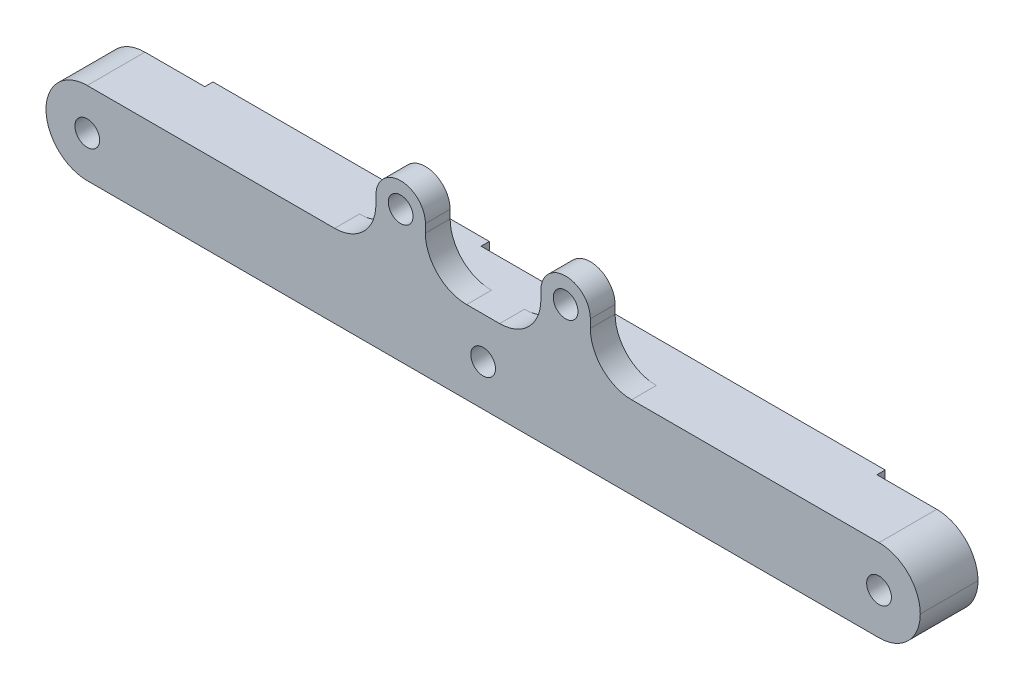
ISO-10303-21;
HEADER;
FILE_DESCRIPTION(('STEP AP214'),'2;1');
FILE_NAME('part.step','',(''),(''),'','','');
FILE_SCHEMA(('AUTOMOTIVE_DESIGN { 1 0 10303 214 1 1 1 1 }'));
ENDSEC;
DATA;
#1=APPLICATION_CONTEXT('core data for automotive mechanical design processes');
#2=APPLICATION_PROTOCOL_DEFINITION('international standard','automotive_design',2000,#1);
#3=PRODUCT_CONTEXT('',#1,'mechanical');
#4=PRODUCT('Part','Part','',(#3));
#5=PRODUCT_RELATED_PRODUCT_CATEGORY('part','',(#4));
#6=PRODUCT_DEFINITION_FORMATION('','',#4);
#7=PRODUCT_DEFINITION_CONTEXT('part definition',#1,'design');
#8=PRODUCT_DEFINITION('design','',#6,#7);
#9=PRODUCT_DEFINITION_SHAPE('','',#8);
#10=(LENGTH_UNIT() NAMED_UNIT(*) SI_UNIT(.MILLI.,.METRE.));
#11=(NAMED_UNIT(*) PLANE_ANGLE_UNIT() SI_UNIT($,.RADIAN.));
#12=(NAMED_UNIT(*) SI_UNIT($,.STERADIAN.) SOLID_ANGLE_UNIT());
#13=UNCERTAINTY_MEASURE_WITH_UNIT(LENGTH_MEASURE(1.E-05),#10,'distance_accuracy_value','');
#14=(GEOMETRIC_REPRESENTATION_CONTEXT(3) GLOBAL_UNCERTAINTY_ASSIGNED_CONTEXT((#13)) GLOBAL_UNIT_ASSIGNED_CONTEXT((#10,
#11,#12)) REPRESENTATION_CONTEXT('',''));
#15=CARTESIAN_POINT('',(0.,0.,0.));
#16=DIRECTION('',(0.,0.,1.));
#17=DIRECTION('',(1.,0.,0.));
#18=AXIS2_PLACEMENT_3D('',#15,#16,#17);
#19=CARTESIAN_POINT('',(0.,0.,0.));
#20=DIRECTION('',(0.,0.,-1.));
#21=DIRECTION('',(-1.,0.,0.));
#22=AXIS2_PLACEMENT_3D('',#19,#20,#21);
#23=PLANE('',#22);
#24=CARTESIAN_POINT('',(0.,0.,0.));
#25=DIRECTION('',(0.,0.,1.));
#26=DIRECTION('',(1.,0.,0.));
#27=AXIS2_PLACEMENT_3D('',#24,#25,#26);
#28=CIRCLE('',#27,1.5);
#29=CARTESIAN_POINT('',(1.5,0.,0.));
#30=VERTEX_POINT('',#29);
#31=EDGE_CURVE('E361',#30,#30,#28,.T.);
#32=ORIENTED_EDGE('',*,*,#31,.T.);
#33=EDGE_LOOP('',(#32));
#34=FACE_BOUND('',#33,.T.);
#35=DIRECTION('',(1.,0.,0.));
#36=VECTOR('',#35,1.);
#37=CARTESIAN_POINT('',(-53.,-5.,0.));
#38=LINE('',#37,#36);
#39=CARTESIAN_POINT('',(-7.25,-5.,0.));
#40=VERTEX_POINT('',#39);
#41=CARTESIAN_POINT('',(7.25,-5.,0.));
#42=VERTEX_POINT('',#41);
#43=EDGE_CURVE('E228',#40,#42,#38,.T.);
#44=ORIENTED_EDGE('',*,*,#43,.F.);
#45=DIRECTION('',(0.,-1.,0.));
#46=VECTOR('',#45,1.);
#47=CARTESIAN_POINT('',(-7.25,5.,0.));
#48=LINE('',#47,#46);
#49=CARTESIAN_POINT('',(-7.25,5.,0.));
#50=VERTEX_POINT('',#49);
#51=EDGE_CURVE('E217',#50,#40,#48,.T.);
#52=ORIENTED_EDGE('',*,*,#51,.F.);
#53=DIRECTION('',(-1.,0.,0.));
#54=VECTOR('',#53,1.);
#55=CARTESIAN_POINT('',(-53.,5.,0.));
#56=LINE('',#55,#54);
#57=CARTESIAN_POINT('',(7.25,5.,0.));
#58=VERTEX_POINT('',#57);
#59=EDGE_CURVE('E226',#58,#50,#56,.T.);
#60=ORIENTED_EDGE('',*,*,#59,.F.);
#61=DIRECTION('',(0.,1.,0.));
#62=VECTOR('',#61,1.);
#63=CARTESIAN_POINT('',(7.25,5.,0.));
#64=LINE('',#63,#62);
#65=EDGE_CURVE('E425',#42,#58,#64,.T.);
#66=ORIENTED_EDGE('',*,*,#65,.F.);
#67=EDGE_LOOP('',(#44,#52,#60,#66));
#68=FACE_BOUND('',#67,.T.);
#69=ADVANCED_FACE('F37',(#34,#68),#23,.T.);
#70=CARTESIAN_POINT('',(-48.,0.,0.));
#71=DIRECTION('',(0.,0.,1.));
#72=DIRECTION('',(1.,0.,0.));
#73=AXIS2_PLACEMENT_3D('',#70,#71,#72);
#74=CIRCLE('',#73,1.5);
#75=CARTESIAN_POINT('',(-46.5,0.,0.));
#76=VERTEX_POINT('',#75);
#77=EDGE_CURVE('E284',#76,#76,#74,.T.);
#78=ORIENTED_EDGE('',*,*,#77,.T.);
#79=EDGE_LOOP('',(#78));
#80=FACE_BOUND('',#79,.T.);
#81=CARTESIAN_POINT('',(-40.75,5.,0.));
#82=VERTEX_POINT('',#81);
#83=CARTESIAN_POINT('',(-48.,5.,0.));
#84=VERTEX_POINT('',#83);
#85=EDGE_CURVE('E237',#82,#84,#56,.T.);
#86=ORIENTED_EDGE('',*,*,#85,.F.);
#87=DIRECTION('',(0.,1.,0.));
#88=VECTOR('',#87,1.);
#89=CARTESIAN_POINT('',(-40.75,5.,0.));
#90=LINE('',#89,#88);
#91=CARTESIAN_POINT('',(-40.75,-5.,0.));
#92=VERTEX_POINT('',#91);
#93=EDGE_CURVE('E229',#92,#82,#90,.T.);
#94=ORIENTED_EDGE('',*,*,#93,.F.);
#95=CARTESIAN_POINT('',(-48.,-5.,0.));
#96=VERTEX_POINT('',#95);
#97=EDGE_CURVE('E245',#96,#92,#38,.T.);
#98=ORIENTED_EDGE('',*,*,#97,.F.);
#99=CARTESIAN_POINT('',(-48.,0.,0.));
#100=DIRECTION('',(0.,0.,-1.));
#101=DIRECTION('',(-1.,0.,0.));
#102=AXIS2_PLACEMENT_3D('',#99,#100,#101);
#103=CIRCLE('',#102,5.);
#104=CARTESIAN_POINT('',(-53.,0.,0.));
#105=VERTEX_POINT('',#104);
#106=EDGE_CURVE('E258',#96,#105,#103,.T.);
#107=ORIENTED_EDGE('',*,*,#106,.T.);
#108=CARTESIAN_POINT('',(-48.,0.,0.));
#109=DIRECTION('',(0.,0.,-1.));
#110=DIRECTION('',(-1.,0.,0.));
#111=AXIS2_PLACEMENT_3D('',#108,#109,#110);
#112=CIRCLE('',#111,5.);
#113=EDGE_CURVE('E255',#105,#84,#112,.T.);
#114=ORIENTED_EDGE('',*,*,#113,.T.);
#115=EDGE_LOOP('',(#86,#94,#98,#107,#114));
#116=FACE_BOUND('',#115,.T.);
#117=ADVANCED_FACE('F516',(#80,#116),#23,.T.);
#118=DIRECTION('',(0.,-1.,0.));
#119=VECTOR('',#118,1.);
#120=CARTESIAN_POINT('',(40.75,5.,0.));
#121=LINE('',#120,#119);
#122=CARTESIAN_POINT('',(40.75,5.,0.));
#123=VERTEX_POINT('',#122);
#124=CARTESIAN_POINT('',(40.75,-5.,0.));
#125=VERTEX_POINT('',#124);
#126=EDGE_CURVE('E60',#123,#125,#121,.T.);
#127=ORIENTED_EDGE('',*,*,#126,.F.);
#128=CARTESIAN_POINT('',(48.,5.,0.));
#129=VERTEX_POINT('',#128);
#130=EDGE_CURVE('E236',#129,#123,#56,.T.);
#131=ORIENTED_EDGE('',*,*,#130,.F.);
#132=CARTESIAN_POINT('',(48.,0.,0.));
#133=DIRECTION('',(0.,0.,-1.));
#134=DIRECTION('',(-1.,0.,0.));
#135=AXIS2_PLACEMENT_3D('',#132,#133,#134);
#136=CIRCLE('',#135,5.);
#137=CARTESIAN_POINT('',(53.,0.,0.));
#138=VERTEX_POINT('',#137);
#139=EDGE_CURVE('E260',#129,#138,#136,.T.);
#140=ORIENTED_EDGE('',*,*,#139,.T.);
#141=CARTESIAN_POINT('',(48.,0.,0.));
#142=DIRECTION('',(0.,0.,-1.));
#143=DIRECTION('',(-1.,0.,0.));
#144=AXIS2_PLACEMENT_3D('',#141,#142,#143);
#145=CIRCLE('',#144,5.);
#146=CARTESIAN_POINT('',(48.,-5.,0.));
#147=VERTEX_POINT('',#146);
#148=EDGE_CURVE('E262',#138,#147,#145,.T.);
#149=ORIENTED_EDGE('',*,*,#148,.T.);
#150=EDGE_CURVE('E239',#125,#147,#38,.T.);
#151=ORIENTED_EDGE('',*,*,#150,.F.);
#152=EDGE_LOOP('',(#127,#131,#140,#149,#151));
#153=FACE_BOUND('',#152,.T.);
#154=CARTESIAN_POINT('',(48.,0.,0.));
#155=DIRECTION('',(0.,0.,1.));
#156=DIRECTION('',(1.,0.,0.));
#157=AXIS2_PLACEMENT_3D('',#154,#155,#156);
#158=CIRCLE('',#157,1.5);
#159=CARTESIAN_POINT('',(49.5,0.,0.));
#160=VERTEX_POINT('',#159);
#161=EDGE_CURVE('E371',#160,#160,#158,.T.);
#162=ORIENTED_EDGE('',*,*,#161,.T.);
#163=EDGE_LOOP('',(#162));
#164=FACE_BOUND('',#163,.T.);
#165=ADVANCED_FACE('F411',(#153,#164),#23,.T.);
#166=CARTESIAN_POINT('',(-53.,5.,7.));
#167=DIRECTION('',(0.,-1.,0.));
#168=DIRECTION('',(0.,0.,-1.));
#169=AXIS2_PLACEMENT_3D('',#166,#167,#168);
#170=PLANE('',#169);
#171=DIRECTION('',(1.,0.,0.));
#172=VECTOR('',#171,1.);
#173=CARTESIAN_POINT('',(7.,5.,4.));
#174=LINE('',#173,#172);
#175=CARTESIAN_POINT('',(2.,5.,4.));
#176=VERTEX_POINT('',#175);
#177=CARTESIAN_POINT('',(18.,5.,4.));
#178=VERTEX_POINT('',#177);
#179=EDGE_CURVE('E345',#176,#178,#174,.T.);
#180=ORIENTED_EDGE('',*,*,#179,.T.);
#181=DIRECTION('',(0.,0.,1.));
#182=VECTOR('',#181,1.);
#183=CARTESIAN_POINT('',(18.,5.,7.));
#184=LINE('',#183,#182);
#185=CARTESIAN_POINT('',(18.,5.,7.));
#186=VERTEX_POINT('',#185);
#187=EDGE_CURVE('E314',#178,#186,#184,.T.);
#188=ORIENTED_EDGE('',*,*,#187,.T.);
#189=DIRECTION('',(-1.,0.,0.));
#190=VECTOR('',#189,1.);
#191=CARTESIAN_POINT('',(-53.,5.,7.));
#192=LINE('',#191,#190);
#193=CARTESIAN_POINT('',(48.,5.,7.));
#194=VERTEX_POINT('',#193);
#195=EDGE_CURVE('E328',#194,#186,#192,.T.);
#196=ORIENTED_EDGE('',*,*,#195,.F.);
#197=DIRECTION('',(0.,0.,-1.));
#198=VECTOR('',#197,1.);
#199=CARTESIAN_POINT('',(48.,5.,7.));
#200=LINE('',#199,#198);
#201=EDGE_CURVE('E276',#194,#129,#200,.T.);
#202=ORIENTED_EDGE('',*,*,#201,.T.);
#203=ORIENTED_EDGE('',*,*,#130,.T.);
#204=DIRECTION('',(0.,0.,1.));
#205=VECTOR('',#204,1.);
#206=CARTESIAN_POINT('',(40.75,5.,-1.));
#207=LINE('',#206,#205);
#208=CARTESIAN_POINT('',(40.75,5.,-1.));
#209=VERTEX_POINT('',#208);
#210=EDGE_CURVE('E424',#209,#123,#207,.T.);
#211=ORIENTED_EDGE('',*,*,#210,.F.);
#212=DIRECTION('',(1.,0.,0.));
#213=VECTOR('',#212,1.);
#214=CARTESIAN_POINT('',(40.75,5.,-1.));
#215=LINE('',#214,#213);
#216=CARTESIAN_POINT('',(7.25,5.,-1.));
#217=VERTEX_POINT('',#216);
#218=EDGE_CURVE('E430',#217,#209,#215,.T.);
#219=ORIENTED_EDGE('',*,*,#218,.F.);
#220=DIRECTION('',(0.,0.,1.));
#221=VECTOR('',#220,1.);
#222=CARTESIAN_POINT('',(7.25,5.,-1.));
#223=LINE('',#222,#221);
#224=EDGE_CURVE('E235',#217,#58,#223,.T.);
#225=ORIENTED_EDGE('',*,*,#224,.T.);
#226=ORIENTED_EDGE('',*,*,#59,.T.);
#227=DIRECTION('',(0.,0.,1.));
#228=VECTOR('',#227,1.);
#229=CARTESIAN_POINT('',(-7.25,5.,-1.));
#230=LINE('',#229,#228);
#231=CARTESIAN_POINT('',(-7.25,5.,-1.));
#232=VERTEX_POINT('',#231);
#233=EDGE_CURVE('E213',#232,#50,#230,.T.);
#234=ORIENTED_EDGE('',*,*,#233,.F.);
#235=DIRECTION('',(1.,0.,0.));
#236=VECTOR('',#235,1.);
#237=CARTESIAN_POINT('',(-7.25,5.,-1.));
#238=LINE('',#237,#236);
#239=CARTESIAN_POINT('',(-40.75,5.,-1.));
#240=VERTEX_POINT('',#239);
#241=EDGE_CURVE('E222',#240,#232,#238,.T.);
#242=ORIENTED_EDGE('',*,*,#241,.F.);
#243=DIRECTION('',(0.,0.,1.));
#244=VECTOR('',#243,1.);
#245=CARTESIAN_POINT('',(-40.75,5.,-1.));
#246=LINE('',#245,#244);
#247=EDGE_CURVE('E52',#240,#82,#246,.T.);
#248=ORIENTED_EDGE('',*,*,#247,.T.);
#249=ORIENTED_EDGE('',*,*,#85,.T.);
#250=DIRECTION('',(0.,0.,-1.));
#251=VECTOR('',#250,1.);
#252=CARTESIAN_POINT('',(-48.,5.,7.));
#253=LINE('',#252,#251);
#254=CARTESIAN_POINT('',(-48.,5.,7.));
#255=VERTEX_POINT('',#254);
#256=EDGE_CURVE('E273',#84,#255,#253,.F.);
#257=ORIENTED_EDGE('',*,*,#256,.T.);
#258=CARTESIAN_POINT('',(-18.,5.,7.));
#259=VERTEX_POINT('',#258);
#260=EDGE_CURVE('E248',#259,#255,#192,.T.);
#261=ORIENTED_EDGE('',*,*,#260,.F.);
#262=DIRECTION('',(0.,0.,1.));
#263=VECTOR('',#262,1.);
#264=CARTESIAN_POINT('',(-18.,5.,7.));
#265=LINE('',#264,#263);
#266=CARTESIAN_POINT('',(-18.,5.,4.));
#267=VERTEX_POINT('',#266);
#268=EDGE_CURVE('E287',#259,#267,#265,.F.);
#269=ORIENTED_EDGE('',*,*,#268,.T.);
#270=DIRECTION('',(1.,0.,0.));
#271=VECTOR('',#270,1.);
#272=CARTESIAN_POINT('',(-7.,5.,4.));
#273=LINE('',#272,#271);
#274=CARTESIAN_POINT('',(-2.,5.,4.));
#275=VERTEX_POINT('',#274);
#276=EDGE_CURVE('E452',#267,#275,#273,.T.);
#277=ORIENTED_EDGE('',*,*,#276,.T.);
#278=DIRECTION('',(0.,0.,1.));
#279=VECTOR('',#278,1.);
#280=CARTESIAN_POINT('',(-2.,5.,7.));
#281=LINE('',#280,#279);
#282=CARTESIAN_POINT('',(-2.,5.,7.));
#283=VERTEX_POINT('',#282);
#284=EDGE_CURVE('E297',#275,#283,#281,.T.);
#285=ORIENTED_EDGE('',*,*,#284,.T.);
#286=CARTESIAN_POINT('',(2.,5.,7.));
#287=VERTEX_POINT('',#286);
#288=EDGE_CURVE('E378',#287,#283,#192,.T.);
#289=ORIENTED_EDGE('',*,*,#288,.F.);
#290=DIRECTION('',(0.,0.,1.));
#291=VECTOR('',#290,1.);
#292=CARTESIAN_POINT('',(2.,5.,7.));
#293=LINE('',#292,#291);
#294=EDGE_CURVE('E300',#287,#176,#293,.F.);
#295=ORIENTED_EDGE('',*,*,#294,.T.);
#296=EDGE_LOOP('',(#180,#188,#196,#202,#203,#211,#219,#225,#226,#234,#242,#248,#249,#257,#261,
#269,#277,#285,#289,#295));
#297=FACE_BOUND('',#296,.T.);
#298=ADVANCED_FACE('F232',(#297),#170,.F.);
#299=CARTESIAN_POINT('',(-53.,-5.,7.));
#300=DIRECTION('',(0.,1.,0.));
#301=DIRECTION('',(0.,0.,1.));
#302=AXIS2_PLACEMENT_3D('',#299,#300,#301);
#303=PLANE('',#302);
#304=DIRECTION('',(1.,0.,0.));
#305=VECTOR('',#304,1.);
#306=CARTESIAN_POINT('',(-53.,-5.,7.));
#307=LINE('',#306,#305);
#308=CARTESIAN_POINT('',(-48.,-5.,7.));
#309=VERTEX_POINT('',#308);
#310=CARTESIAN_POINT('',(48.,-5.,7.));
#311=VERTEX_POINT('',#310);
#312=EDGE_CURVE('E243',#309,#311,#307,.T.);
#313=ORIENTED_EDGE('',*,*,#312,.F.);
#314=DIRECTION('',(0.,0.,-1.));
#315=VECTOR('',#314,1.);
#316=CARTESIAN_POINT('',(-48.,-5.,7.));
#317=LINE('',#316,#315);
#318=EDGE_CURVE('E252',#309,#96,#317,.T.);
#319=ORIENTED_EDGE('',*,*,#318,.T.);
#320=ORIENTED_EDGE('',*,*,#97,.T.);
#321=DIRECTION('',(0.,0.,1.));
#322=VECTOR('',#321,1.);
#323=CARTESIAN_POINT('',(-40.75,-5.,-1.));
#324=LINE('',#323,#322);
#325=CARTESIAN_POINT('',(-40.75,-5.,-1.));
#326=VERTEX_POINT('',#325);
#327=EDGE_CURVE('E881',#326,#92,#324,.T.);
#328=ORIENTED_EDGE('',*,*,#327,.F.);
#329=DIRECTION('',(-1.,0.,0.));
#330=VECTOR('',#329,1.);
#331=CARTESIAN_POINT('',(-7.25,-5.,-1.));
#332=LINE('',#331,#330);
#333=CARTESIAN_POINT('',(-7.25,-5.,-1.));
#334=VERTEX_POINT('',#333);
#335=EDGE_CURVE('E883',#334,#326,#332,.T.);
#336=ORIENTED_EDGE('',*,*,#335,.F.);
#337=DIRECTION('',(0.,0.,1.));
#338=VECTOR('',#337,1.);
#339=CARTESIAN_POINT('',(-7.25,-5.,-1.));
#340=LINE('',#339,#338);
#341=EDGE_CURVE('E884',#334,#40,#340,.T.);
#342=ORIENTED_EDGE('',*,*,#341,.T.);
#343=ORIENTED_EDGE('',*,*,#43,.T.);
#344=DIRECTION('',(0.,0.,1.));
#345=VECTOR('',#344,1.);
#346=CARTESIAN_POINT('',(7.25,-5.,-1.));
#347=LINE('',#346,#345);
#348=CARTESIAN_POINT('',(7.25,-5.,-1.));
#349=VERTEX_POINT('',#348);
#350=EDGE_CURVE('E421',#349,#42,#347,.T.);
#351=ORIENTED_EDGE('',*,*,#350,.F.);
#352=DIRECTION('',(-1.,0.,0.));
#353=VECTOR('',#352,1.);
#354=CARTESIAN_POINT('',(40.75,-5.,-1.));
#355=LINE('',#354,#353);
#356=CARTESIAN_POINT('',(40.75,-5.,-1.));
#357=VERTEX_POINT('',#356);
#358=EDGE_CURVE('E416',#357,#349,#355,.T.);
#359=ORIENTED_EDGE('',*,*,#358,.F.);
#360=DIRECTION('',(0.,0.,1.));
#361=VECTOR('',#360,1.);
#362=CARTESIAN_POINT('',(40.75,-5.,-1.));
#363=LINE('',#362,#361);
#364=EDGE_CURVE('E414',#357,#125,#363,.T.);
#365=ORIENTED_EDGE('',*,*,#364,.T.);
#366=ORIENTED_EDGE('',*,*,#150,.T.);
#367=DIRECTION('',(0.,0.,-1.));
#368=VECTOR('',#367,1.);
#369=CARTESIAN_POINT('',(48.,-5.,7.));
#370=LINE('',#369,#368);
#371=EDGE_CURVE('E249',#147,#311,#370,.F.);
#372=ORIENTED_EDGE('',*,*,#371,.T.);
#373=EDGE_LOOP('',(#313,#319,#320,#328,#336,#342,#343,#351,#359,#365,#366,#372));
#374=FACE_BOUND('',#373,.T.);
#375=ADVANCED_FACE('F396',(#374),#303,.F.);
#376=CARTESIAN_POINT('',(0.,0.,7.));
#377=DIRECTION('',(0.,0.,-1.));
#378=DIRECTION('',(-1.,0.,0.));
#379=AXIS2_PLACEMENT_3D('',#376,#377,#378);
#380=PLANE('',#379);
#381=CARTESIAN_POINT('',(-48.,0.,7.));
#382=DIRECTION('',(0.,0.,1.));
#383=DIRECTION('',(1.,0.,0.));
#384=AXIS2_PLACEMENT_3D('',#381,#382,#383);
#385=CIRCLE('',#384,1.5);
#386=CARTESIAN_POINT('',(-46.5,0.,7.));
#387=VERTEX_POINT('',#386);
#388=EDGE_CURVE('E365',#387,#387,#385,.T.);
#389=ORIENTED_EDGE('',*,*,#388,.F.);
#390=EDGE_LOOP('',(#389));
#391=FACE_BOUND('',#390,.T.);
#392=CARTESIAN_POINT('',(48.,0.,7.));
#393=DIRECTION('',(0.,0.,1.));
#394=DIRECTION('',(1.,0.,0.));
#395=AXIS2_PLACEMENT_3D('',#392,#393,#394);
#396=CIRCLE('',#395,1.5);
#397=CARTESIAN_POINT('',(49.5,0.,7.));
#398=VERTEX_POINT('',#397);
#399=EDGE_CURVE('E368',#398,#398,#396,.T.);
#400=ORIENTED_EDGE('',*,*,#399,.F.);
#401=EDGE_LOOP('',(#400));
#402=FACE_BOUND('',#401,.T.);
#403=CARTESIAN_POINT('',(0.,0.,7.));
#404=DIRECTION('',(0.,0.,1.));
#405=DIRECTION('',(1.,0.,0.));
#406=AXIS2_PLACEMENT_3D('',#403,#404,#405);
#407=CIRCLE('',#406,1.5);
#408=CARTESIAN_POINT('',(1.5,0.,7.));
#409=VERTEX_POINT('',#408);
#410=EDGE_CURVE('E374',#409,#409,#407,.T.);
#411=ORIENTED_EDGE('',*,*,#410,.F.);
#412=EDGE_LOOP('',(#411));
#413=FACE_BOUND('',#412,.T.);
#414=ORIENTED_EDGE('',*,*,#312,.T.);
#415=CARTESIAN_POINT('',(48.,0.,7.));
#416=DIRECTION('',(0.,0.,-1.));
#417=DIRECTION('',(-1.,0.,0.));
#418=AXIS2_PLACEMENT_3D('',#415,#416,#417);
#419=CIRCLE('',#418,5.);
#420=CARTESIAN_POINT('',(53.,0.,7.));
#421=VERTEX_POINT('',#420);
#422=EDGE_CURVE('E271',#311,#421,#419,.F.);
#423=ORIENTED_EDGE('',*,*,#422,.T.);
#424=CARTESIAN_POINT('',(48.,0.,7.));
#425=DIRECTION('',(0.,0.,-1.));
#426=DIRECTION('',(-1.,0.,0.));
#427=AXIS2_PLACEMENT_3D('',#424,#425,#426);
#428=CIRCLE('',#427,5.);
#429=EDGE_CURVE('E269',#421,#194,#428,.F.);
#430=ORIENTED_EDGE('',*,*,#429,.T.);
#431=ORIENTED_EDGE('',*,*,#195,.T.);
#432=CARTESIAN_POINT('',(18.,10.,7.));
#433=DIRECTION('',(0.,0.,-1.));
#434=DIRECTION('',(-1.,0.,0.));
#435=AXIS2_PLACEMENT_3D('',#432,#433,#434);
#436=CIRCLE('',#435,5.);
#437=CARTESIAN_POINT('',(13.,10.,7.));
#438=VERTEX_POINT('',#437);
#439=EDGE_CURVE('E45',#186,#438,#436,.T.);
#440=ORIENTED_EDGE('',*,*,#439,.T.);
#441=DIRECTION('',(0.,1.,0.));
#442=VECTOR('',#441,1.);
#443=CARTESIAN_POINT('',(13.,5.,7.));
#444=LINE('',#443,#442);
#445=CARTESIAN_POINT('',(13.,11.,7.));
#446=VERTEX_POINT('',#445);
#447=EDGE_CURVE('E325',#438,#446,#444,.T.);
#448=ORIENTED_EDGE('',*,*,#447,.T.);
#449=CARTESIAN_POINT('',(10.,11.,7.));
#450=DIRECTION('',(0.,0.,1.));
#451=DIRECTION('',(1.,0.,0.));
#452=AXIS2_PLACEMENT_3D('',#449,#450,#451);
#453=CIRCLE('',#452,3.);
#454=CARTESIAN_POINT('',(7.,11.,7.));
#455=VERTEX_POINT('',#454);
#456=EDGE_CURVE('E356',#446,#455,#453,.T.);
#457=ORIENTED_EDGE('',*,*,#456,.T.);
#458=DIRECTION('',(0.,-1.,0.));
#459=VECTOR('',#458,1.);
#460=CARTESIAN_POINT('',(7.,11.,7.));
#461=LINE('',#460,#459);
#462=CARTESIAN_POINT('',(7.,10.,7.));
#463=VERTEX_POINT('',#462);
#464=EDGE_CURVE('E339',#455,#463,#461,.T.);
#465=ORIENTED_EDGE('',*,*,#464,.T.);
#466=CARTESIAN_POINT('',(2.,10.,7.));
#467=DIRECTION('',(0.,0.,-1.));
#468=DIRECTION('',(-1.,0.,0.));
#469=AXIS2_PLACEMENT_3D('',#466,#467,#468);
#470=CIRCLE('',#469,5.);
#471=EDGE_CURVE('E305',#463,#287,#470,.T.);
#472=ORIENTED_EDGE('',*,*,#471,.T.);
#473=ORIENTED_EDGE('',*,*,#288,.T.);
#474=CARTESIAN_POINT('',(-2.,10.,7.));
#475=DIRECTION('',(0.,0.,-1.));
#476=DIRECTION('',(-1.,0.,0.));
#477=AXIS2_PLACEMENT_3D('',#474,#475,#476);
#478=CIRCLE('',#477,5.);
#479=CARTESIAN_POINT('',(-7.,10.,7.));
#480=VERTEX_POINT('',#479);
#481=EDGE_CURVE('E309',#283,#480,#478,.T.);
#482=ORIENTED_EDGE('',*,*,#481,.T.);
#483=DIRECTION('',(0.,1.,0.));
#484=VECTOR('',#483,1.);
#485=CARTESIAN_POINT('',(-7.,11.,7.));
#486=LINE('',#485,#484);
#487=CARTESIAN_POINT('',(-7.,11.,7.));
#488=VERTEX_POINT('',#487);
#489=EDGE_CURVE('E442',#480,#488,#486,.T.);
#490=ORIENTED_EDGE('',*,*,#489,.T.);
#491=CARTESIAN_POINT('',(-10.,11.,7.));
#492=DIRECTION('',(0.,0.,1.));
#493=DIRECTION('',(1.,0.,0.));
#494=AXIS2_PLACEMENT_3D('',#491,#492,#493);
#495=CIRCLE('',#494,3.);
#496=CARTESIAN_POINT('',(-13.,11.,7.));
#497=VERTEX_POINT('',#496);
#498=EDGE_CURVE('E447',#488,#497,#495,.T.);
#499=ORIENTED_EDGE('',*,*,#498,.T.);
#500=DIRECTION('',(0.,-1.,0.));
#501=VECTOR('',#500,1.);
#502=CARTESIAN_POINT('',(-13.,5.,7.));
#503=LINE('',#502,#501);
#504=CARTESIAN_POINT('',(-13.,10.,7.));
#505=VERTEX_POINT('',#504);
#506=EDGE_CURVE('E444',#497,#505,#503,.T.);
#507=ORIENTED_EDGE('',*,*,#506,.T.);
#508=CARTESIAN_POINT('',(-18.,10.,7.));
#509=DIRECTION('',(0.,0.,-1.));
#510=DIRECTION('',(-1.,0.,0.));
#511=AXIS2_PLACEMENT_3D('',#508,#509,#510);
#512=CIRCLE('',#511,5.);
#513=EDGE_CURVE('E290',#505,#259,#512,.T.);
#514=ORIENTED_EDGE('',*,*,#513,.T.);
#515=ORIENTED_EDGE('',*,*,#260,.T.);
#516=CARTESIAN_POINT('',(-48.,0.,7.));
#517=DIRECTION('',(0.,0.,-1.));
#518=DIRECTION('',(-1.,0.,0.));
#519=AXIS2_PLACEMENT_3D('',#516,#517,#518);
#520=CIRCLE('',#519,5.);
#521=CARTESIAN_POINT('',(-53.,0.,7.));
#522=VERTEX_POINT('',#521);
#523=EDGE_CURVE('E265',#255,#522,#520,.F.);
#524=ORIENTED_EDGE('',*,*,#523,.T.);
#525=CARTESIAN_POINT('',(-48.,0.,7.));
#526=DIRECTION('',(0.,0.,-1.));
#527=DIRECTION('',(-1.,0.,0.));
#528=AXIS2_PLACEMENT_3D('',#525,#526,#527);
#529=CIRCLE('',#528,5.);
#530=EDGE_CURVE('E267',#522,#309,#529,.F.);
#531=ORIENTED_EDGE('',*,*,#530,.T.);
#532=EDGE_LOOP('',(#414,#423,#430,#431,#440,#448,#457,#465,#472,#473,#482,#490,#499,#507,#514,
#515,#524,#531));
#533=FACE_BOUND('',#532,.T.);
#534=CARTESIAN_POINT('',(10.,11.,7.));
#535=DIRECTION('',(0.,0.,1.));
#536=DIRECTION('',(1.,0.,0.));
#537=AXIS2_PLACEMENT_3D('',#534,#535,#536);
#538=CIRCLE('',#537,1.5);
#539=CARTESIAN_POINT('',(11.5,11.,7.));
#540=VERTEX_POINT('',#539);
#541=EDGE_CURVE('E462',#540,#540,#538,.T.);
#542=ORIENTED_EDGE('',*,*,#541,.F.);
#543=EDGE_LOOP('',(#542));
#544=FACE_BOUND('',#543,.T.);
#545=CARTESIAN_POINT('',(-10.,11.,7.));
#546=DIRECTION('',(0.,0.,1.));
#547=DIRECTION('',(1.,0.,0.));
#548=AXIS2_PLACEMENT_3D('',#545,#546,#547);
#549=CIRCLE('',#548,1.5);
#550=CARTESIAN_POINT('',(-8.5,11.,7.));
#551=VERTEX_POINT('',#550);
#552=EDGE_CURVE('E459',#551,#551,#549,.T.);
#553=ORIENTED_EDGE('',*,*,#552,.F.);
#554=EDGE_LOOP('',(#553));
#555=FACE_BOUND('',#554,.T.);
#556=ADVANCED_FACE('F322',(#391,#402,#413,#533,#544,#555),#380,.F.);
#557=CARTESIAN_POINT('',(-48.,0.,7.));
#558=DIRECTION('',(0.,0.,-1.));
#559=DIRECTION('',(-1.,0.,0.));
#560=AXIS2_PLACEMENT_3D('',#557,#558,#559);
#561=CYLINDRICAL_SURFACE('',#560,5.);
#562=DIRECTION('',(0.,0.,-1.));
#563=VECTOR('',#562,1.);
#564=CARTESIAN_POINT('',(-53.,0.,7.));
#565=LINE('',#564,#563);
#566=EDGE_CURVE('E240',#522,#105,#565,.T.);
#567=ORIENTED_EDGE('',*,*,#566,.F.);
#568=ORIENTED_EDGE('',*,*,#523,.F.);
#569=ORIENTED_EDGE('',*,*,#256,.F.);
#570=ORIENTED_EDGE('',*,*,#113,.F.);
#571=EDGE_LOOP('',(#567,#568,#569,#570));
#572=FACE_BOUND('',#571,.T.);
#573=ADVANCED_FACE('F389',(#572),#561,.T.);
#574=CARTESIAN_POINT('',(-48.,0.,7.));
#575=DIRECTION('',(0.,0.,-1.));
#576=DIRECTION('',(-1.,0.,0.));
#577=AXIS2_PLACEMENT_3D('',#574,#575,#576);
#578=CYLINDRICAL_SURFACE('',#577,5.);
#579=ORIENTED_EDGE('',*,*,#530,.F.);
#580=ORIENTED_EDGE('',*,*,#566,.T.);
#581=ORIENTED_EDGE('',*,*,#106,.F.);
#582=ORIENTED_EDGE('',*,*,#318,.F.);
#583=EDGE_LOOP('',(#579,#580,#581,#582));
#584=FACE_BOUND('',#583,.T.);
#585=ADVANCED_FACE('F393',(#584),#578,.T.);
#586=CARTESIAN_POINT('',(48.,0.,7.));
#587=DIRECTION('',(0.,0.,-1.));
#588=DIRECTION('',(-1.,0.,0.));
#589=AXIS2_PLACEMENT_3D('',#586,#587,#588);
#590=CYLINDRICAL_SURFACE('',#589,5.);
#591=ORIENTED_EDGE('',*,*,#201,.F.);
#592=ORIENTED_EDGE('',*,*,#429,.F.);
#593=DIRECTION('',(0.,0.,-1.));
#594=VECTOR('',#593,1.);
#595=CARTESIAN_POINT('',(53.,0.,7.));
#596=LINE('',#595,#594);
#597=EDGE_CURVE('E281',#138,#421,#596,.F.);
#598=ORIENTED_EDGE('',*,*,#597,.F.);
#599=ORIENTED_EDGE('',*,*,#139,.F.);
#600=EDGE_LOOP('',(#591,#592,#598,#599));
#601=FACE_BOUND('',#600,.T.);
#602=ADVANCED_FACE('F407',(#601),#590,.T.);
#603=CARTESIAN_POINT('',(48.,0.,7.));
#604=DIRECTION('',(0.,0.,-1.));
#605=DIRECTION('',(-1.,0.,0.));
#606=AXIS2_PLACEMENT_3D('',#603,#604,#605);
#607=CYLINDRICAL_SURFACE('',#606,5.);
#608=ORIENTED_EDGE('',*,*,#422,.F.);
#609=ORIENTED_EDGE('',*,*,#371,.F.);
#610=ORIENTED_EDGE('',*,*,#148,.F.);
#611=ORIENTED_EDGE('',*,*,#597,.T.);
#612=EDGE_LOOP('',(#608,#609,#610,#611));
#613=FACE_BOUND('',#612,.T.);
#614=ADVANCED_FACE('F402',(#613),#607,.T.);
#615=CARTESIAN_POINT('',(0.,0.,0.));
#616=DIRECTION('',(0.,0.,1.));
#617=DIRECTION('',(1.,0.,0.));
#618=AXIS2_PLACEMENT_3D('',#615,#616,#617);
#619=CYLINDRICAL_SURFACE('',#618,1.5);
#620=ORIENTED_EDGE('',*,*,#31,.F.);
#621=EDGE_LOOP('',(#620));
#622=FACE_BOUND('',#621,.T.);
#623=ORIENTED_EDGE('',*,*,#410,.T.);
#624=EDGE_LOOP('',(#623));
#625=FACE_BOUND('',#624,.T.);
#626=ADVANCED_FACE('F540',(#622,#625),#619,.F.);
#627=CARTESIAN_POINT('',(48.,0.,0.));
#628=DIRECTION('',(0.,0.,1.));
#629=DIRECTION('',(1.,0.,0.));
#630=AXIS2_PLACEMENT_3D('',#627,#628,#629);
#631=CYLINDRICAL_SURFACE('',#630,1.5);
#632=ORIENTED_EDGE('',*,*,#161,.F.);
#633=EDGE_LOOP('',(#632));
#634=FACE_BOUND('',#633,.T.);
#635=ORIENTED_EDGE('',*,*,#399,.T.);
#636=EDGE_LOOP('',(#635));
#637=FACE_BOUND('',#636,.T.);
#638=ADVANCED_FACE('F811',(#634,#637),#631,.F.);
#639=CARTESIAN_POINT('',(-48.,0.,0.));
#640=DIRECTION('',(0.,0.,1.));
#641=DIRECTION('',(1.,0.,0.));
#642=AXIS2_PLACEMENT_3D('',#639,#640,#641);
#643=CYLINDRICAL_SURFACE('',#642,1.5);
#644=ORIENTED_EDGE('',*,*,#77,.F.);
#645=EDGE_LOOP('',(#644));
#646=FACE_BOUND('',#645,.T.);
#647=ORIENTED_EDGE('',*,*,#388,.T.);
#648=EDGE_LOOP('',(#647));
#649=FACE_BOUND('',#648,.T.);
#650=ADVANCED_FACE('F821',(#646,#649),#643,.F.);
#651=CARTESIAN_POINT('',(10.,11.,4.));
#652=DIRECTION('',(0.,0.,1.));
#653=DIRECTION('',(1.,0.,0.));
#654=AXIS2_PLACEMENT_3D('',#651,#652,#653);
#655=CYLINDRICAL_SURFACE('',#654,3.);
#656=ORIENTED_EDGE('',*,*,#456,.F.);
#657=DIRECTION('',(0.,0.,1.));
#658=VECTOR('',#657,1.);
#659=CARTESIAN_POINT('',(13.,11.,4.));
#660=LINE('',#659,#658);
#661=CARTESIAN_POINT('',(13.,11.,4.));
#662=VERTEX_POINT('',#661);
#663=EDGE_CURVE('E336',#662,#446,#660,.T.);
#664=ORIENTED_EDGE('',*,*,#663,.F.);
#665=CARTESIAN_POINT('',(10.,11.,4.));
#666=DIRECTION('',(0.,0.,1.));
#667=DIRECTION('',(1.,0.,0.));
#668=AXIS2_PLACEMENT_3D('',#665,#666,#667);
#669=CIRCLE('',#668,3.);
#670=CARTESIAN_POINT('',(7.,11.,4.));
#671=VERTEX_POINT('',#670);
#672=EDGE_CURVE('E338',#662,#671,#669,.T.);
#673=ORIENTED_EDGE('',*,*,#672,.T.);
#674=DIRECTION('',(0.,0.,1.));
#675=VECTOR('',#674,1.);
#676=CARTESIAN_POINT('',(7.,11.,4.));
#677=LINE('',#676,#675);
#678=EDGE_CURVE('E349',#671,#455,#677,.T.);
#679=ORIENTED_EDGE('',*,*,#678,.T.);
#680=EDGE_LOOP('',(#656,#664,#673,#679));
#681=FACE_BOUND('',#680,.T.);
#682=ADVANCED_FACE('F624',(#681),#655,.T.);
#683=CARTESIAN_POINT('',(13.,5.,4.));
#684=DIRECTION('',(1.,0.,0.));
#685=DIRECTION('',(0.,1.,0.));
#686=AXIS2_PLACEMENT_3D('',#683,#684,#685);
#687=PLANE('',#686);
#688=ORIENTED_EDGE('',*,*,#447,.F.);
#689=DIRECTION('',(0.,0.,1.));
#690=VECTOR('',#689,1.);
#691=CARTESIAN_POINT('',(13.,10.,4.));
#692=LINE('',#691,#690);
#693=CARTESIAN_POINT('',(13.,10.,4.));
#694=VERTEX_POINT('',#693);
#695=EDGE_CURVE('E317',#438,#694,#692,.F.);
#696=ORIENTED_EDGE('',*,*,#695,.T.);
#697=DIRECTION('',(0.,1.,0.));
#698=VECTOR('',#697,1.);
#699=CARTESIAN_POINT('',(13.,5.,4.));
#700=LINE('',#699,#698);
#701=EDGE_CURVE('E346',#694,#662,#700,.T.);
#702=ORIENTED_EDGE('',*,*,#701,.T.);
#703=ORIENTED_EDGE('',*,*,#663,.T.);
#704=EDGE_LOOP('',(#688,#696,#702,#703));
#705=FACE_BOUND('',#704,.T.);
#706=ADVANCED_FACE('F333',(#705),#687,.T.);
#707=CARTESIAN_POINT('',(7.,11.,4.));
#708=DIRECTION('',(-1.,0.,0.));
#709=DIRECTION('',(0.,0.,1.));
#710=AXIS2_PLACEMENT_3D('',#707,#708,#709);
#711=PLANE('',#710);
#712=DIRECTION('',(0.,-1.,0.));
#713=VECTOR('',#712,1.);
#714=CARTESIAN_POINT('',(7.,11.,4.));
#715=LINE('',#714,#713);
#716=CARTESIAN_POINT('',(7.,10.,4.));
#717=VERTEX_POINT('',#716);
#718=EDGE_CURVE('E352',#671,#717,#715,.T.);
#719=ORIENTED_EDGE('',*,*,#718,.T.);
#720=DIRECTION('',(0.,0.,1.));
#721=VECTOR('',#720,1.);
#722=CARTESIAN_POINT('',(7.,10.,4.));
#723=LINE('',#722,#721);
#724=EDGE_CURVE('E294',#717,#463,#723,.T.);
#725=ORIENTED_EDGE('',*,*,#724,.T.);
#726=ORIENTED_EDGE('',*,*,#464,.F.);
#727=ORIENTED_EDGE('',*,*,#678,.F.);
#728=EDGE_LOOP('',(#719,#725,#726,#727));
#729=FACE_BOUND('',#728,.T.);
#730=ADVANCED_FACE('F472',(#729),#711,.T.);
#731=CARTESIAN_POINT('',(10.,11.,4.));
#732=DIRECTION('',(0.,0.,1.));
#733=DIRECTION('',(1.,0.,0.));
#734=AXIS2_PLACEMENT_3D('',#731,#732,#733);
#735=PLANE('',#734);
#736=CARTESIAN_POINT('',(10.,11.,4.));
#737=DIRECTION('',(0.,0.,1.));
#738=DIRECTION('',(1.,0.,0.));
#739=AXIS2_PLACEMENT_3D('',#736,#737,#738);
#740=CIRCLE('',#739,1.5);
#741=CARTESIAN_POINT('',(11.5,11.,4.));
#742=VERTEX_POINT('',#741);
#743=EDGE_CURVE('E358',#742,#742,#740,.T.);
#744=ORIENTED_EDGE('',*,*,#743,.T.);
#745=EDGE_LOOP('',(#744));
#746=FACE_BOUND('',#745,.T.);
#747=ORIENTED_EDGE('',*,*,#672,.F.);
#748=ORIENTED_EDGE('',*,*,#701,.F.);
#749=CARTESIAN_POINT('',(18.,10.,4.));
#750=DIRECTION('',(0.,0.,1.));
#751=DIRECTION('',(1.,0.,0.));
#752=AXIS2_PLACEMENT_3D('',#749,#750,#751);
#753=CIRCLE('',#752,5.);
#754=EDGE_CURVE('E11',#694,#178,#753,.T.);
#755=ORIENTED_EDGE('',*,*,#754,.T.);
#756=ORIENTED_EDGE('',*,*,#179,.F.);
#757=CARTESIAN_POINT('',(2.,10.,4.));
#758=DIRECTION('',(0.,0.,1.));
#759=DIRECTION('',(1.,0.,0.));
#760=AXIS2_PLACEMENT_3D('',#757,#758,#759);
#761=CIRCLE('',#760,5.);
#762=EDGE_CURVE('E307',#176,#717,#761,.T.);
#763=ORIENTED_EDGE('',*,*,#762,.T.);
#764=ORIENTED_EDGE('',*,*,#718,.F.);
#765=EDGE_LOOP('',(#747,#748,#755,#756,#763,#764));
#766=FACE_BOUND('',#765,.T.);
#767=ADVANCED_FACE('F344',(#746,#766),#735,.F.);
#768=CARTESIAN_POINT('',(10.,11.,4.));
#769=DIRECTION('',(0.,0.,1.));
#770=DIRECTION('',(1.,0.,0.));
#771=AXIS2_PLACEMENT_3D('',#768,#769,#770);
#772=CYLINDRICAL_SURFACE('',#771,1.5);
#773=ORIENTED_EDGE('',*,*,#743,.F.);
#774=EDGE_LOOP('',(#773));
#775=FACE_BOUND('',#774,.T.);
#776=ORIENTED_EDGE('',*,*,#541,.T.);
#777=EDGE_LOOP('',(#776));
#778=FACE_BOUND('',#777,.T.);
#779=ADVANCED_FACE('F564',(#775,#778),#772,.F.);
#780=CARTESIAN_POINT('',(-10.,11.,4.));
#781=DIRECTION('',(0.,0.,1.));
#782=DIRECTION('',(1.,0.,0.));
#783=AXIS2_PLACEMENT_3D('',#780,#781,#782);
#784=CYLINDRICAL_SURFACE('',#783,3.);
#785=ORIENTED_EDGE('',*,*,#498,.F.);
#786=DIRECTION('',(0.,0.,1.));
#787=VECTOR('',#786,1.);
#788=CARTESIAN_POINT('',(-7.,11.,4.));
#789=LINE('',#788,#787);
#790=CARTESIAN_POINT('',(-7.,11.,4.));
#791=VERTEX_POINT('',#790);
#792=EDGE_CURVE('E420',#791,#488,#789,.T.);
#793=ORIENTED_EDGE('',*,*,#792,.F.);
#794=CARTESIAN_POINT('',(-10.,11.,4.));
#795=DIRECTION('',(0.,0.,1.));
#796=DIRECTION('',(1.,0.,0.));
#797=AXIS2_PLACEMENT_3D('',#794,#795,#796);
#798=CIRCLE('',#797,3.);
#799=CARTESIAN_POINT('',(-13.,11.,4.));
#800=VERTEX_POINT('',#799);
#801=EDGE_CURVE('E445',#791,#800,#798,.T.);
#802=ORIENTED_EDGE('',*,*,#801,.T.);
#803=DIRECTION('',(0.,0.,1.));
#804=VECTOR('',#803,1.);
#805=CARTESIAN_POINT('',(-13.,11.,4.));
#806=LINE('',#805,#804);
#807=EDGE_CURVE('E437',#800,#497,#806,.T.);
#808=ORIENTED_EDGE('',*,*,#807,.T.);
#809=EDGE_LOOP('',(#785,#793,#802,#808));
#810=FACE_BOUND('',#809,.T.);
#811=ADVANCED_FACE('F492',(#810),#784,.T.);
#812=CARTESIAN_POINT('',(-7.,11.,4.));
#813=DIRECTION('',(1.,0.,0.));
#814=DIRECTION('',(0.,0.,-1.));
#815=AXIS2_PLACEMENT_3D('',#812,#813,#814);
#816=PLANE('',#815);
#817=ORIENTED_EDGE('',*,*,#489,.F.);
#818=DIRECTION('',(0.,0.,1.));
#819=VECTOR('',#818,1.);
#820=CARTESIAN_POINT('',(-7.,10.,4.));
#821=LINE('',#820,#819);
#822=CARTESIAN_POINT('',(-7.,10.,4.));
#823=VERTEX_POINT('',#822);
#824=EDGE_CURVE('E303',#480,#823,#821,.F.);
#825=ORIENTED_EDGE('',*,*,#824,.T.);
#826=DIRECTION('',(0.,1.,0.));
#827=VECTOR('',#826,1.);
#828=CARTESIAN_POINT('',(-7.,11.,4.));
#829=LINE('',#828,#827);
#830=EDGE_CURVE('E439',#823,#791,#829,.T.);
#831=ORIENTED_EDGE('',*,*,#830,.T.);
#832=ORIENTED_EDGE('',*,*,#792,.T.);
#833=EDGE_LOOP('',(#817,#825,#831,#832));
#834=FACE_BOUND('',#833,.T.);
#835=ADVANCED_FACE('F486',(#834),#816,.T.);
#836=CARTESIAN_POINT('',(-13.,5.,4.));
#837=DIRECTION('',(-1.,0.,0.));
#838=DIRECTION('',(0.,-1.,0.));
#839=AXIS2_PLACEMENT_3D('',#836,#837,#838);
#840=PLANE('',#839);
#841=DIRECTION('',(0.,-1.,0.));
#842=VECTOR('',#841,1.);
#843=CARTESIAN_POINT('',(-13.,5.,4.));
#844=LINE('',#843,#842);
#845=CARTESIAN_POINT('',(-13.,10.,4.));
#846=VERTEX_POINT('',#845);
#847=EDGE_CURVE('E454',#800,#846,#844,.T.);
#848=ORIENTED_EDGE('',*,*,#847,.T.);
#849=DIRECTION('',(0.,0.,1.));
#850=VECTOR('',#849,1.);
#851=CARTESIAN_POINT('',(-13.,10.,4.));
#852=LINE('',#851,#850);
#853=EDGE_CURVE('E278',#846,#505,#852,.T.);
#854=ORIENTED_EDGE('',*,*,#853,.T.);
#855=ORIENTED_EDGE('',*,*,#506,.F.);
#856=ORIENTED_EDGE('',*,*,#807,.F.);
#857=EDGE_LOOP('',(#848,#854,#855,#856));
#858=FACE_BOUND('',#857,.T.);
#859=ADVANCED_FACE('F495',(#858),#840,.T.);
#860=CARTESIAN_POINT('',(-10.,11.,4.));
#861=DIRECTION('',(0.,0.,1.));
#862=DIRECTION('',(1.,0.,0.));
#863=AXIS2_PLACEMENT_3D('',#860,#861,#862);
#864=PLANE('',#863);
#865=CARTESIAN_POINT('',(-10.,11.,4.));
#866=DIRECTION('',(0.,0.,1.));
#867=DIRECTION('',(1.,0.,0.));
#868=AXIS2_PLACEMENT_3D('',#865,#866,#867);
#869=CIRCLE('',#868,1.5);
#870=CARTESIAN_POINT('',(-8.5,11.,4.));
#871=VERTEX_POINT('',#870);
#872=EDGE_CURVE('E450',#871,#871,#869,.T.);
#873=ORIENTED_EDGE('',*,*,#872,.T.);
#874=EDGE_LOOP('',(#873));
#875=FACE_BOUND('',#874,.T.);
#876=ORIENTED_EDGE('',*,*,#801,.F.);
#877=ORIENTED_EDGE('',*,*,#830,.F.);
#878=CARTESIAN_POINT('',(-2.,10.,4.));
#879=DIRECTION('',(0.,0.,1.));
#880=DIRECTION('',(1.,0.,0.));
#881=AXIS2_PLACEMENT_3D('',#878,#879,#880);
#882=CIRCLE('',#881,5.);
#883=EDGE_CURVE('E311',#823,#275,#882,.T.);
#884=ORIENTED_EDGE('',*,*,#883,.T.);
#885=ORIENTED_EDGE('',*,*,#276,.F.);
#886=CARTESIAN_POINT('',(-18.,10.,4.));
#887=DIRECTION('',(0.,0.,1.));
#888=DIRECTION('',(1.,0.,0.));
#889=AXIS2_PLACEMENT_3D('',#886,#887,#888);
#890=CIRCLE('',#889,5.);
#891=EDGE_CURVE('E292',#267,#846,#890,.T.);
#892=ORIENTED_EDGE('',*,*,#891,.T.);
#893=ORIENTED_EDGE('',*,*,#847,.F.);
#894=EDGE_LOOP('',(#876,#877,#884,#885,#892,#893));
#895=FACE_BOUND('',#894,.T.);
#896=ADVANCED_FACE('F502',(#875,#895),#864,.F.);
#897=CARTESIAN_POINT('',(-10.,11.,4.));
#898=DIRECTION('',(0.,0.,1.));
#899=DIRECTION('',(1.,0.,0.));
#900=AXIS2_PLACEMENT_3D('',#897,#898,#899);
#901=CYLINDRICAL_SURFACE('',#900,1.5);
#902=ORIENTED_EDGE('',*,*,#872,.F.);
#903=EDGE_LOOP('',(#902));
#904=FACE_BOUND('',#903,.T.);
#905=ORIENTED_EDGE('',*,*,#552,.T.);
#906=EDGE_LOOP('',(#905));
#907=FACE_BOUND('',#906,.T.);
#908=ADVANCED_FACE('F504',(#904,#907),#901,.F.);
#909=CARTESIAN_POINT('',(-18.,10.,4.));
#910=DIRECTION('',(0.,0.,1.));
#911=DIRECTION('',(1.,0.,0.));
#912=AXIS2_PLACEMENT_3D('',#909,#910,#911);
#913=CYLINDRICAL_SURFACE('',#912,5.);
#914=ORIENTED_EDGE('',*,*,#891,.F.);
#915=ORIENTED_EDGE('',*,*,#268,.F.);
#916=ORIENTED_EDGE('',*,*,#513,.F.);
#917=ORIENTED_EDGE('',*,*,#853,.F.);
#918=EDGE_LOOP('',(#914,#915,#916,#917));
#919=FACE_BOUND('',#918,.T.);
#920=ADVANCED_FACE('F500',(#919),#913,.F.);
#921=CARTESIAN_POINT('',(2.,10.,4.));
#922=DIRECTION('',(0.,0.,1.));
#923=DIRECTION('',(1.,0.,0.));
#924=AXIS2_PLACEMENT_3D('',#921,#922,#923);
#925=CYLINDRICAL_SURFACE('',#924,5.);
#926=ORIENTED_EDGE('',*,*,#762,.F.);
#927=ORIENTED_EDGE('',*,*,#294,.F.);
#928=ORIENTED_EDGE('',*,*,#471,.F.);
#929=ORIENTED_EDGE('',*,*,#724,.F.);
#930=EDGE_LOOP('',(#926,#927,#928,#929));
#931=FACE_BOUND('',#930,.T.);
#932=ADVANCED_FACE('F476',(#931),#925,.F.);
#933=CARTESIAN_POINT('',(-2.,10.,7.));
#934=DIRECTION('',(0.,0.,1.));
#935=DIRECTION('',(1.,0.,0.));
#936=AXIS2_PLACEMENT_3D('',#933,#934,#935);
#937=CYLINDRICAL_SURFACE('',#936,5.);
#938=ORIENTED_EDGE('',*,*,#883,.F.);
#939=ORIENTED_EDGE('',*,*,#824,.F.);
#940=ORIENTED_EDGE('',*,*,#481,.F.);
#941=ORIENTED_EDGE('',*,*,#284,.F.);
#942=EDGE_LOOP('',(#938,#939,#940,#941));
#943=FACE_BOUND('',#942,.T.);
#944=ADVANCED_FACE('F482',(#943),#937,.F.);
#945=CARTESIAN_POINT('',(18.,10.,7.));
#946=DIRECTION('',(0.,0.,1.));
#947=DIRECTION('',(1.,0.,0.));
#948=AXIS2_PLACEMENT_3D('',#945,#946,#947);
#949=CYLINDRICAL_SURFACE('',#948,5.);
#950=ORIENTED_EDGE('',*,*,#754,.F.);
#951=ORIENTED_EDGE('',*,*,#695,.F.);
#952=ORIENTED_EDGE('',*,*,#439,.F.);
#953=ORIENTED_EDGE('',*,*,#187,.F.);
#954=EDGE_LOOP('',(#950,#951,#952,#953));
#955=FACE_BOUND('',#954,.T.);
#956=ADVANCED_FACE('F39',(#955),#949,.F.);
#957=CARTESIAN_POINT('',(40.75,5.,-1.));
#958=DIRECTION('',(-1.,0.,0.));
#959=DIRECTION('',(0.,0.,1.));
#960=AXIS2_PLACEMENT_3D('',#957,#958,#959);
#961=PLANE('',#960);
#962=ORIENTED_EDGE('',*,*,#126,.T.);
#963=ORIENTED_EDGE('',*,*,#364,.F.);
#964=DIRECTION('',(0.,-1.,0.));
#965=VECTOR('',#964,1.);
#966=CARTESIAN_POINT('',(40.75,5.,-1.));
#967=LINE('',#966,#965);
#968=EDGE_CURVE('E427',#209,#357,#967,.T.);
#969=ORIENTED_EDGE('',*,*,#968,.F.);
#970=ORIENTED_EDGE('',*,*,#210,.T.);
#971=EDGE_LOOP('',(#962,#963,#969,#970));
#972=FACE_BOUND('',#971,.T.);
#973=ADVANCED_FACE('F423',(#972),#961,.F.);
#974=CARTESIAN_POINT('',(7.25,5.,-1.));
#975=DIRECTION('',(1.,0.,0.));
#976=DIRECTION('',(0.,0.,-1.));
#977=AXIS2_PLACEMENT_3D('',#974,#975,#976);
#978=PLANE('',#977);
#979=ORIENTED_EDGE('',*,*,#65,.T.);
#980=ORIENTED_EDGE('',*,*,#224,.F.);
#981=DIRECTION('',(0.,1.,0.));
#982=VECTOR('',#981,1.);
#983=CARTESIAN_POINT('',(7.25,5.,-1.));
#984=LINE('',#983,#982);
#985=EDGE_CURVE('E893',#349,#217,#984,.T.);
#986=ORIENTED_EDGE('',*,*,#985,.F.);
#987=ORIENTED_EDGE('',*,*,#350,.T.);
#988=EDGE_LOOP('',(#979,#980,#986,#987));
#989=FACE_BOUND('',#988,.T.);
#990=ADVANCED_FACE('F553',(#989),#978,.F.);
#991=CARTESIAN_POINT('',(0.,0.,-1.));
#992=DIRECTION('',(0.,0.,-1.));
#993=DIRECTION('',(-1.,0.,0.));
#994=AXIS2_PLACEMENT_3D('',#991,#992,#993);
#995=PLANE('',#994);
#996=ORIENTED_EDGE('',*,*,#968,.T.);
#997=ORIENTED_EDGE('',*,*,#358,.T.);
#998=ORIENTED_EDGE('',*,*,#985,.T.);
#999=ORIENTED_EDGE('',*,*,#218,.T.);
#1000=EDGE_LOOP('',(#996,#997,#998,#999));
#1001=FACE_BOUND('',#1000,.T.);
#1002=ADVANCED_FACE('F558',(#1001),#995,.T.);
#1003=CARTESIAN_POINT('',(-7.25,5.,-1.));
#1004=DIRECTION('',(-1.,0.,0.));
#1005=DIRECTION('',(0.,-1.,0.));
#1006=AXIS2_PLACEMENT_3D('',#1003,#1004,#1005);
#1007=PLANE('',#1006);
#1008=ORIENTED_EDGE('',*,*,#51,.T.);
#1009=ORIENTED_EDGE('',*,*,#341,.F.);
#1010=DIRECTION('',(0.,-1.,0.));
#1011=VECTOR('',#1010,1.);
#1012=CARTESIAN_POINT('',(-7.25,5.,-1.));
#1013=LINE('',#1012,#1011);
#1014=EDGE_CURVE('E220',#232,#334,#1013,.T.);
#1015=ORIENTED_EDGE('',*,*,#1014,.F.);
#1016=ORIENTED_EDGE('',*,*,#233,.T.);
#1017=EDGE_LOOP('',(#1008,#1009,#1015,#1016));
#1018=FACE_BOUND('',#1017,.T.);
#1019=ADVANCED_FACE('F215',(#1018),#1007,.F.);
#1020=CARTESIAN_POINT('',(-40.75,5.,-1.));
#1021=DIRECTION('',(1.,0.,0.));
#1022=DIRECTION('',(0.,0.,-1.));
#1023=AXIS2_PLACEMENT_3D('',#1020,#1021,#1022);
#1024=PLANE('',#1023);
#1025=ORIENTED_EDGE('',*,*,#93,.T.);
#1026=ORIENTED_EDGE('',*,*,#247,.F.);
#1027=DIRECTION('',(0.,1.,0.));
#1028=VECTOR('',#1027,1.);
#1029=CARTESIAN_POINT('',(-40.75,5.,-1.));
#1030=LINE('',#1029,#1028);
#1031=EDGE_CURVE('E886',#326,#240,#1030,.T.);
#1032=ORIENTED_EDGE('',*,*,#1031,.F.);
#1033=ORIENTED_EDGE('',*,*,#327,.T.);
#1034=EDGE_LOOP('',(#1025,#1026,#1032,#1033));
#1035=FACE_BOUND('',#1034,.T.);
#1036=ADVANCED_FACE('F707',(#1035),#1024,.F.);
#1037=CARTESIAN_POINT('',(0.,0.,-1.));
#1038=DIRECTION('',(0.,0.,-1.));
#1039=DIRECTION('',(-1.,0.,0.));
#1040=AXIS2_PLACEMENT_3D('',#1037,#1038,#1039);
#1041=PLANE('',#1040);
#1042=ORIENTED_EDGE('',*,*,#1014,.T.);
#1043=ORIENTED_EDGE('',*,*,#335,.T.);
#1044=ORIENTED_EDGE('',*,*,#1031,.T.);
#1045=ORIENTED_EDGE('',*,*,#241,.T.);
#1046=EDGE_LOOP('',(#1042,#1043,#1044,#1045));
#1047=FACE_BOUND('',#1046,.T.);
#1048=ADVANCED_FACE('F716',(#1047),#1041,.T.);
#1049=CLOSED_SHELL('',(#69,#117,#165,#298,#375,#556,#573,#585,#602,#614,#626,#638,#650,#682,
#706,#730,#767,#779,#811,#835,#859,#896,#908,#920,#932,#944,#956,#973,#990,#1002,#1019,#1036,#1048));
#1050=MANIFOLD_SOLID_BREP('B2',#1049);
#1051=ADVANCED_BREP_SHAPE_REPRESENTATION('',(#18,#1050),#14);
#1052=SHAPE_DEFINITION_REPRESENTATION(#9,#1051);
ENDSEC;
END-ISO-10303-21;
